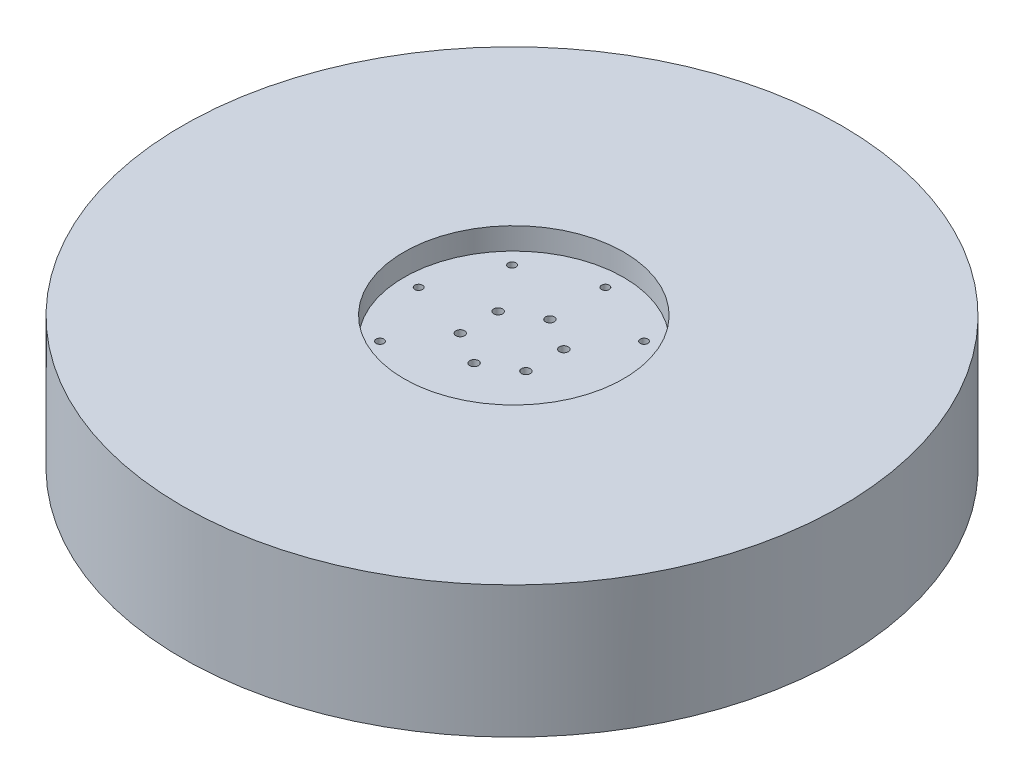
ISO-10303-21;
HEADER;
FILE_DESCRIPTION(('STEP AP214'),'2;1');
FILE_NAME('part.step','',(''),(''),'','','');
FILE_SCHEMA(('AUTOMOTIVE_DESIGN { 1 0 10303 214 1 1 1 1 }'));
ENDSEC;
DATA;
#1=APPLICATION_CONTEXT('core data for automotive mechanical design processes');
#2=APPLICATION_PROTOCOL_DEFINITION('international standard','automotive_design',2000,#1);
#3=PRODUCT_CONTEXT('',#1,'mechanical');
#4=PRODUCT('Part','Part','',(#3));
#5=PRODUCT_RELATED_PRODUCT_CATEGORY('part','',(#4));
#6=PRODUCT_DEFINITION_FORMATION('','',#4);
#7=PRODUCT_DEFINITION_CONTEXT('part definition',#1,'design');
#8=PRODUCT_DEFINITION('design','',#6,#7);
#9=PRODUCT_DEFINITION_SHAPE('','',#8);
#10=(LENGTH_UNIT() NAMED_UNIT(*) SI_UNIT(.MILLI.,.METRE.));
#11=(NAMED_UNIT(*) PLANE_ANGLE_UNIT() SI_UNIT($,.RADIAN.));
#12=(NAMED_UNIT(*) SI_UNIT($,.STERADIAN.) SOLID_ANGLE_UNIT());
#13=UNCERTAINTY_MEASURE_WITH_UNIT(LENGTH_MEASURE(1.E-05),#10,'distance_accuracy_value','');
#14=(GEOMETRIC_REPRESENTATION_CONTEXT(3) GLOBAL_UNCERTAINTY_ASSIGNED_CONTEXT((#13)) GLOBAL_UNIT_ASSIGNED_CONTEXT((#10,
#11,#12)) REPRESENTATION_CONTEXT('',''));
#15=CARTESIAN_POINT('',(0.,0.,0.));
#16=DIRECTION('',(0.,0.,1.));
#17=DIRECTION('',(1.,0.,0.));
#18=AXIS2_PLACEMENT_3D('',#15,#16,#17);
#19=CARTESIAN_POINT('',(0.,0.,0.));
#20=DIRECTION('',(0.,1.,0.));
#21=DIRECTION('',(0.,0.,1.));
#22=AXIS2_PLACEMENT_3D('',#19,#20,#21);
#23=PLANE('',#22);
#24=CARTESIAN_POINT('',(-59.5916333933439,0.,-0.301972321435213));
#25=DIRECTION('',(0.,1.,0.));
#26=DIRECTION('',(0.,0.,1.));
#27=AXIS2_PLACEMENT_3D('',#24,#25,#26);
#28=CIRCLE('',#27,1.75);
#29=CARTESIAN_POINT('',(-59.5916333933439,0.,1.44802767856479));
#30=VERTEX_POINT('',#29);
#31=EDGE_CURVE('E45',#30,#30,#28,.T.);
#32=ORIENTED_EDGE('',*,*,#31,.T.);
#33=EDGE_LOOP('',(#32));
#34=FACE_BOUND('',#33,.T.);
#35=CARTESIAN_POINT('',(-47.1436715937708,0.,29.7500658789924));
#36=DIRECTION('',(0.,1.,0.));
#37=DIRECTION('',(0.,0.,1.));
#38=AXIS2_PLACEMENT_3D('',#35,#36,#37);
#39=CIRCLE('',#38,1.75);
#40=CARTESIAN_POINT('',(-47.1436715937708,0.,31.5000658789924));
#41=VERTEX_POINT('',#40);
#42=EDGE_CURVE('E50',#41,#41,#39,.T.);
#43=ORIENTED_EDGE('',*,*,#42,.T.);
#44=EDGE_LOOP('',(#43));
#45=FACE_BOUND('',#44,.T.);
#46=CARTESIAN_POINT('',(-17.0916333933419,0.,42.1980276785628));
#47=DIRECTION('',(0.,1.,0.));
#48=DIRECTION('',(0.,0.,1.));
#49=AXIS2_PLACEMENT_3D('',#46,#47,#48);
#50=CIRCLE('',#49,1.75000000000001);
#51=CARTESIAN_POINT('',(-17.0916333933419,0.,43.9480276785628));
#52=VERTEX_POINT('',#51);
#53=EDGE_CURVE('E71',#52,#52,#50,.T.);
#54=ORIENTED_EDGE('',*,*,#53,.T.);
#55=EDGE_LOOP('',(#54));
#56=FACE_BOUND('',#55,.T.);
#57=CARTESIAN_POINT('',(12.9604048070858,0.,29.7500658789897));
#58=DIRECTION('',(0.,1.,0.));
#59=DIRECTION('',(0.,0.,1.));
#60=AXIS2_PLACEMENT_3D('',#57,#58,#59);
#61=CIRCLE('',#60,1.75);
#62=CARTESIAN_POINT('',(12.9604048070858,0.,31.5000658789897));
#63=VERTEX_POINT('',#62);
#64=EDGE_CURVE('E68',#63,#63,#61,.T.);
#65=ORIENTED_EDGE('',*,*,#64,.T.);
#66=EDGE_LOOP('',(#65));
#67=FACE_BOUND('',#66,.T.);
#68=CARTESIAN_POINT('',(25.4083666066562,0.,-0.301972321439144));
#69=DIRECTION('',(0.,1.,0.));
#70=DIRECTION('',(0.,0.,1.));
#71=AXIS2_PLACEMENT_3D('',#68,#69,#70);
#72=CIRCLE('',#71,1.75);
#73=CARTESIAN_POINT('',(25.4083666066562,0.,1.44802767856086));
#74=VERTEX_POINT('',#73);
#75=EDGE_CURVE('E65',#74,#74,#72,.T.);
#76=ORIENTED_EDGE('',*,*,#75,.T.);
#77=EDGE_LOOP('',(#76));
#78=FACE_BOUND('',#77,.T.);
#79=CARTESIAN_POINT('',(12.9604048070831,0.,-30.3540105218669));
#80=DIRECTION('',(0.,1.,0.));
#81=DIRECTION('',(0.,0.,1.));
#82=AXIS2_PLACEMENT_3D('',#79,#80,#81);
#83=CIRCLE('',#82,1.75);
#84=CARTESIAN_POINT('',(12.9604048070831,0.,-28.6040105218668));
#85=VERTEX_POINT('',#84);
#86=EDGE_CURVE('E62',#85,#85,#83,.T.);
#87=ORIENTED_EDGE('',*,*,#86,.T.);
#88=EDGE_LOOP('',(#87));
#89=FACE_BOUND('',#88,.T.);
#90=CARTESIAN_POINT('',(-17.0916333933463,0.,-42.8019723214372));
#91=DIRECTION('',(0.,1.,0.));
#92=DIRECTION('',(0.,0.,1.));
#93=AXIS2_PLACEMENT_3D('',#90,#91,#92);
#94=CIRCLE('',#93,1.75);
#95=CARTESIAN_POINT('',(-17.0916333933463,0.,-41.0519723214372));
#96=VERTEX_POINT('',#95);
#97=EDGE_CURVE('E59',#96,#96,#94,.T.);
#98=ORIENTED_EDGE('',*,*,#97,.T.);
#99=EDGE_LOOP('',(#98));
#100=FACE_BOUND('',#99,.T.);
#101=CARTESIAN_POINT('',(-47.1436715937735,0.,-30.3540105218641));
#102=DIRECTION('',(0.,1.,0.));
#103=DIRECTION('',(0.,0.,1.));
#104=AXIS2_PLACEMENT_3D('',#101,#102,#103);
#105=CIRCLE('',#104,1.75);
#106=CARTESIAN_POINT('',(-47.1436715937735,0.,-28.6040105218641));
#107=VERTEX_POINT('',#106);
#108=EDGE_CURVE('E56',#107,#107,#105,.T.);
#109=ORIENTED_EDGE('',*,*,#108,.T.);
#110=EDGE_LOOP('',(#109));
#111=FACE_BOUND('',#110,.T.);
#112=CARTESIAN_POINT('',(-17.0916333933456,0.,-0.301972321437211));
#113=DIRECTION('',(0.,-1.,0.));
#114=DIRECTION('',(0.,0.,-1.));
#115=AXIS2_PLACEMENT_3D('',#112,#113,#114);
#116=CIRCLE('',#115,29.5);
#117=CARTESIAN_POINT('',(-17.0916333933456,0.,-29.8019723214372));
#118=VERTEX_POINT('',#117);
#119=EDGE_CURVE('E85',#118,#118,#116,.T.);
#120=ORIENTED_EDGE('',*,*,#119,.F.);
#121=EDGE_LOOP('',(#120));
#122=FACE_BOUND('',#121,.T.);
#123=CARTESIAN_POINT('',(-17.0916333933463,0.,-0.301972321437215));
#124=DIRECTION('',(0.,-1.,0.));
#125=DIRECTION('',(0.,0.,-1.));
#126=AXIS2_PLACEMENT_3D('',#123,#124,#125);
#127=CIRCLE('',#126,130.);
#128=CARTESIAN_POINT('',(-17.0916333933463,0.,-130.301972321437));
#129=VERTEX_POINT('',#128);
#130=EDGE_CURVE('E255',#129,#129,#127,.T.);
#131=ORIENTED_EDGE('',*,*,#130,.T.);
#132=EDGE_LOOP('',(#131));
#133=FACE_BOUND('',#132,.T.);
#134=ADVANCED_FACE('F37',(#34,#45,#56,#67,#78,#89,#100,#111,#122,#133),#23,.F.);
#135=CARTESIAN_POINT('',(-17.091633393345,25.,16.9480276785628));
#136=DIRECTION('',(0.,-1.,0.));
#137=DIRECTION('',(0.,0.,-1.));
#138=AXIS2_PLACEMENT_3D('',#135,#136,#137);
#139=CYLINDRICAL_SURFACE('',#138,2.);
#140=CARTESIAN_POINT('',(-17.091633393345,6.6,16.9480276785628));
#141=DIRECTION('',(0.,-1.,0.));
#142=DIRECTION('',(0.,0.,-1.));
#143=AXIS2_PLACEMENT_3D('',#140,#141,#142);
#144=CIRCLE('',#143,2.);
#145=CARTESIAN_POINT('',(-17.091633393345,6.6,14.9480276785628));
#146=VERTEX_POINT('',#145);
#147=EDGE_CURVE('E54',#146,#146,#144,.T.);
#148=ORIENTED_EDGE('',*,*,#147,.T.);
#149=EDGE_LOOP('',(#148));
#150=FACE_BOUND('',#149,.T.);
#151=CARTESIAN_POINT('',(-17.091633393345,15.,16.9480276785628));
#152=DIRECTION('',(0.,1.,0.));
#153=DIRECTION('',(0.,0.,1.));
#154=AXIS2_PLACEMENT_3D('',#151,#152,#153);
#155=CIRCLE('',#154,2.);
#156=CARTESIAN_POINT('',(-17.091633393345,15.,18.9480276785628));
#157=VERTEX_POINT('',#156);
#158=EDGE_CURVE('E90',#157,#157,#155,.T.);
#159=ORIENTED_EDGE('',*,*,#158,.T.);
#160=EDGE_LOOP('',(#159));
#161=FACE_BOUND('',#160,.T.);
#162=ADVANCED_FACE('F106',(#150,#161),#139,.F.);
#163=CARTESIAN_POINT('',(-2.15269517806366,25.,8.32302767856223));
#164=DIRECTION('',(0.,-1.,0.));
#165=DIRECTION('',(0.,0.,-1.));
#166=AXIS2_PLACEMENT_3D('',#163,#164,#165);
#167=CYLINDRICAL_SURFACE('',#166,2.);
#168=CARTESIAN_POINT('',(-2.15269517806366,6.6,8.32302767856223));
#169=DIRECTION('',(0.,-1.,0.));
#170=DIRECTION('',(0.,0.,-1.));
#171=AXIS2_PLACEMENT_3D('',#168,#169,#170);
#172=CIRCLE('',#171,2.);
#173=CARTESIAN_POINT('',(-2.15269517806366,6.6,6.32302767856222));
#174=VERTEX_POINT('',#173);
#175=EDGE_CURVE('E99',#174,#174,#172,.T.);
#176=ORIENTED_EDGE('',*,*,#175,.T.);
#177=EDGE_LOOP('',(#176));
#178=FACE_BOUND('',#177,.T.);
#179=CARTESIAN_POINT('',(-2.15269517806366,15.,8.32302767856223));
#180=DIRECTION('',(0.,1.,0.));
#181=DIRECTION('',(0.,0.,1.));
#182=AXIS2_PLACEMENT_3D('',#179,#180,#181);
#183=CIRCLE('',#182,2.);
#184=CARTESIAN_POINT('',(-2.15269517806366,15.,10.3230276785622));
#185=VERTEX_POINT('',#184);
#186=EDGE_CURVE('E143',#185,#185,#183,.T.);
#187=ORIENTED_EDGE('',*,*,#186,.T.);
#188=EDGE_LOOP('',(#187));
#189=FACE_BOUND('',#188,.T.);
#190=ADVANCED_FACE('F231',(#178,#189),#167,.F.);
#191=CARTESIAN_POINT('',(-2.15269517806434,25.,-8.92697232143782));
#192=DIRECTION('',(0.,-1.,0.));
#193=DIRECTION('',(0.,0.,-1.));
#194=AXIS2_PLACEMENT_3D('',#191,#192,#193);
#195=CYLINDRICAL_SURFACE('',#194,2.);
#196=CARTESIAN_POINT('',(-2.15269517806434,6.6,-8.92697232143782));
#197=DIRECTION('',(0.,-1.,0.));
#198=DIRECTION('',(0.,0.,-1.));
#199=AXIS2_PLACEMENT_3D('',#196,#197,#198);
#200=CIRCLE('',#199,2.);
#201=CARTESIAN_POINT('',(-2.15269517806434,6.6,-10.9269723214378));
#202=VERTEX_POINT('',#201);
#203=EDGE_CURVE('E97',#202,#202,#200,.T.);
#204=ORIENTED_EDGE('',*,*,#203,.T.);
#205=EDGE_LOOP('',(#204));
#206=FACE_BOUND('',#205,.T.);
#207=CARTESIAN_POINT('',(-2.15269517806434,15.,-8.92697232143782));
#208=DIRECTION('',(0.,1.,0.));
#209=DIRECTION('',(0.,0.,1.));
#210=AXIS2_PLACEMENT_3D('',#207,#208,#209);
#211=CIRCLE('',#210,2.);
#212=CARTESIAN_POINT('',(-2.15269517806434,15.,-6.92697232143782));
#213=VERTEX_POINT('',#212);
#214=EDGE_CURVE('E135',#213,#213,#211,.T.);
#215=ORIENTED_EDGE('',*,*,#214,.T.);
#216=EDGE_LOOP('',(#215));
#217=FACE_BOUND('',#216,.T.);
#218=ADVANCED_FACE('F338',(#206,#217),#195,.F.);
#219=CARTESIAN_POINT('',(-17.0916333933463,25.,-17.5519723214372));
#220=DIRECTION('',(0.,-1.,0.));
#221=DIRECTION('',(0.,0.,-1.));
#222=AXIS2_PLACEMENT_3D('',#219,#220,#221);
#223=CYLINDRICAL_SURFACE('',#222,2.);
#224=CARTESIAN_POINT('',(-17.0916333933463,6.6,-17.5519723214372));
#225=DIRECTION('',(0.,-1.,0.));
#226=DIRECTION('',(0.,0.,-1.));
#227=AXIS2_PLACEMENT_3D('',#224,#225,#226);
#228=CIRCLE('',#227,2.);
#229=CARTESIAN_POINT('',(-17.0916333933463,6.6,-19.5519723214372));
#230=VERTEX_POINT('',#229);
#231=EDGE_CURVE('E82',#230,#230,#228,.T.);
#232=ORIENTED_EDGE('',*,*,#231,.T.);
#233=EDGE_LOOP('',(#232));
#234=FACE_BOUND('',#233,.T.);
#235=CARTESIAN_POINT('',(-17.0916333933463,15.,-17.5519723214372));
#236=DIRECTION('',(0.,1.,0.));
#237=DIRECTION('',(0.,0.,1.));
#238=AXIS2_PLACEMENT_3D('',#235,#236,#237);
#239=CIRCLE('',#238,2.);
#240=CARTESIAN_POINT('',(-17.0916333933463,15.,-15.5519723214372));
#241=VERTEX_POINT('',#240);
#242=EDGE_CURVE('E131',#241,#241,#239,.T.);
#243=ORIENTED_EDGE('',*,*,#242,.T.);
#244=EDGE_LOOP('',(#243));
#245=FACE_BOUND('',#244,.T.);
#246=ADVANCED_FACE('F126',(#234,#245),#223,.F.);
#247=CARTESIAN_POINT('',(-32.0305716086274,25.,-8.92697232143676));
#248=DIRECTION('',(0.,-1.,0.));
#249=DIRECTION('',(0.,0.,-1.));
#250=AXIS2_PLACEMENT_3D('',#247,#248,#249);
#251=CYLINDRICAL_SURFACE('',#250,2.);
#252=CARTESIAN_POINT('',(-32.0305716086274,6.6,-8.92697232143676));
#253=DIRECTION('',(0.,-1.,0.));
#254=DIRECTION('',(0.,0.,-1.));
#255=AXIS2_PLACEMENT_3D('',#252,#253,#254);
#256=CIRCLE('',#255,2.);
#257=CARTESIAN_POINT('',(-32.0305716086274,6.6,-10.9269723214368));
#258=VERTEX_POINT('',#257);
#259=EDGE_CURVE('E77',#258,#258,#256,.T.);
#260=ORIENTED_EDGE('',*,*,#259,.T.);
#261=EDGE_LOOP('',(#260));
#262=FACE_BOUND('',#261,.T.);
#263=CARTESIAN_POINT('',(-32.0305716086274,15.,-8.92697232143676));
#264=DIRECTION('',(0.,1.,0.));
#265=DIRECTION('',(0.,0.,1.));
#266=AXIS2_PLACEMENT_3D('',#263,#264,#265);
#267=CIRCLE('',#266,2.);
#268=CARTESIAN_POINT('',(-32.0305716086274,15.,-6.92697232143675));
#269=VERTEX_POINT('',#268);
#270=EDGE_CURVE('E129',#269,#269,#267,.T.);
#271=ORIENTED_EDGE('',*,*,#270,.T.);
#272=EDGE_LOOP('',(#271));
#273=FACE_BOUND('',#272,.T.);
#274=ADVANCED_FACE('F39',(#262,#273),#251,.F.);
#275=CARTESIAN_POINT('',(-32.0305716086269,25.,8.32302767856328));
#276=DIRECTION('',(0.,-1.,0.));
#277=DIRECTION('',(0.,0.,-1.));
#278=AXIS2_PLACEMENT_3D('',#275,#276,#277);
#279=CYLINDRICAL_SURFACE('',#278,2.);
#280=CARTESIAN_POINT('',(-32.0305716086269,6.6,8.32302767856328));
#281=DIRECTION('',(0.,-1.,0.));
#282=DIRECTION('',(0.,0.,-1.));
#283=AXIS2_PLACEMENT_3D('',#280,#281,#282);
#284=CIRCLE('',#283,2.);
#285=CARTESIAN_POINT('',(-32.0305716086269,6.6,6.32302767856328));
#286=VERTEX_POINT('',#285);
#287=EDGE_CURVE('E75',#286,#286,#284,.T.);
#288=ORIENTED_EDGE('',*,*,#287,.T.);
#289=EDGE_LOOP('',(#288));
#290=FACE_BOUND('',#289,.T.);
#291=CARTESIAN_POINT('',(-32.0305716086269,15.,8.32302767856328));
#292=DIRECTION('',(0.,1.,0.));
#293=DIRECTION('',(0.,0.,1.));
#294=AXIS2_PLACEMENT_3D('',#291,#292,#293);
#295=CIRCLE('',#294,2.);
#296=CARTESIAN_POINT('',(-32.0305716086269,15.,10.3230276785633));
#297=VERTEX_POINT('',#296);
#298=EDGE_CURVE('E132',#297,#297,#295,.T.);
#299=ORIENTED_EDGE('',*,*,#298,.T.);
#300=EDGE_LOOP('',(#299));
#301=FACE_BOUND('',#300,.T.);
#302=ADVANCED_FACE('F125',(#290,#301),#279,.F.);
#303=CARTESIAN_POINT('',(-59.5916333933439,25.,-0.301972321435213));
#304=DIRECTION('',(0.,-1.,0.));
#305=DIRECTION('',(0.,0.,-1.));
#306=AXIS2_PLACEMENT_3D('',#303,#304,#305);
#307=CYLINDRICAL_SURFACE('',#306,1.75);
#308=ORIENTED_EDGE('',*,*,#31,.F.);
#309=EDGE_LOOP('',(#308));
#310=FACE_BOUND('',#309,.T.);
#311=CARTESIAN_POINT('',(-59.5916333933439,15.,-0.301972321435213));
#312=DIRECTION('',(0.,1.,0.));
#313=DIRECTION('',(0.,0.,1.));
#314=AXIS2_PLACEMENT_3D('',#311,#312,#313);
#315=CIRCLE('',#314,1.75);
#316=CARTESIAN_POINT('',(-59.5916333933439,15.,1.44802767856479));
#317=VERTEX_POINT('',#316);
#318=EDGE_CURVE('E138',#317,#317,#315,.T.);
#319=ORIENTED_EDGE('',*,*,#318,.T.);
#320=EDGE_LOOP('',(#319));
#321=FACE_BOUND('',#320,.T.);
#322=ADVANCED_FACE('F210',(#310,#321),#307,.F.);
#323=CARTESIAN_POINT('',(-47.1436715937708,25.,29.7500658789924));
#324=DIRECTION('',(0.,-1.,0.));
#325=DIRECTION('',(0.,0.,-1.));
#326=AXIS2_PLACEMENT_3D('',#323,#324,#325);
#327=CYLINDRICAL_SURFACE('',#326,1.75);
#328=ORIENTED_EDGE('',*,*,#42,.F.);
#329=EDGE_LOOP('',(#328));
#330=FACE_BOUND('',#329,.T.);
#331=CARTESIAN_POINT('',(-47.1436715937708,15.,29.7500658789924));
#332=DIRECTION('',(0.,1.,0.));
#333=DIRECTION('',(0.,0.,1.));
#334=AXIS2_PLACEMENT_3D('',#331,#332,#333);
#335=CIRCLE('',#334,1.75);
#336=CARTESIAN_POINT('',(-47.1436715937708,15.,31.5000658789924));
#337=VERTEX_POINT('',#336);
#338=EDGE_CURVE('E168',#337,#337,#335,.T.);
#339=ORIENTED_EDGE('',*,*,#338,.T.);
#340=EDGE_LOOP('',(#339));
#341=FACE_BOUND('',#340,.T.);
#342=ADVANCED_FACE('F212',(#330,#341),#327,.F.);
#343=CARTESIAN_POINT('',(-17.0916333933419,25.,42.1980276785628));
#344=DIRECTION('',(0.,-1.,0.));
#345=DIRECTION('',(0.,0.,-1.));
#346=AXIS2_PLACEMENT_3D('',#343,#344,#345);
#347=CYLINDRICAL_SURFACE('',#346,1.75000000000001);
#348=ORIENTED_EDGE('',*,*,#53,.F.);
#349=EDGE_LOOP('',(#348));
#350=FACE_BOUND('',#349,.T.);
#351=CARTESIAN_POINT('',(-17.0916333933419,15.,42.1980276785628));
#352=DIRECTION('',(0.,1.,0.));
#353=DIRECTION('',(0.,0.,1.));
#354=AXIS2_PLACEMENT_3D('',#351,#352,#353);
#355=CIRCLE('',#354,1.75000000000001);
#356=CARTESIAN_POINT('',(-17.0916333933419,15.,43.9480276785628));
#357=VERTEX_POINT('',#356);
#358=EDGE_CURVE('E172',#357,#357,#355,.T.);
#359=ORIENTED_EDGE('',*,*,#358,.T.);
#360=EDGE_LOOP('',(#359));
#361=FACE_BOUND('',#360,.T.);
#362=ADVANCED_FACE('F219',(#350,#361),#347,.F.);
#363=CARTESIAN_POINT('',(12.9604048070858,25.,29.7500658789897));
#364=DIRECTION('',(0.,-1.,0.));
#365=DIRECTION('',(0.,0.,-1.));
#366=AXIS2_PLACEMENT_3D('',#363,#364,#365);
#367=CYLINDRICAL_SURFACE('',#366,1.75);
#368=ORIENTED_EDGE('',*,*,#64,.F.);
#369=EDGE_LOOP('',(#368));
#370=FACE_BOUND('',#369,.T.);
#371=CARTESIAN_POINT('',(12.9604048070858,15.,29.7500658789897));
#372=DIRECTION('',(0.,1.,0.));
#373=DIRECTION('',(0.,0.,1.));
#374=AXIS2_PLACEMENT_3D('',#371,#372,#373);
#375=CIRCLE('',#374,1.75);
#376=CARTESIAN_POINT('',(12.9604048070858,15.,31.5000658789897));
#377=VERTEX_POINT('',#376);
#378=EDGE_CURVE('E176',#377,#377,#375,.T.);
#379=ORIENTED_EDGE('',*,*,#378,.T.);
#380=EDGE_LOOP('',(#379));
#381=FACE_BOUND('',#380,.T.);
#382=ADVANCED_FACE('F390',(#370,#381),#367,.F.);
#383=CARTESIAN_POINT('',(25.4083666066562,25.,-0.301972321439144));
#384=DIRECTION('',(0.,-1.,0.));
#385=DIRECTION('',(0.,0.,-1.));
#386=AXIS2_PLACEMENT_3D('',#383,#384,#385);
#387=CYLINDRICAL_SURFACE('',#386,1.75);
#388=ORIENTED_EDGE('',*,*,#75,.F.);
#389=EDGE_LOOP('',(#388));
#390=FACE_BOUND('',#389,.T.);
#391=CARTESIAN_POINT('',(25.4083666066562,15.,-0.301972321439144));
#392=DIRECTION('',(0.,1.,0.));
#393=DIRECTION('',(0.,0.,1.));
#394=AXIS2_PLACEMENT_3D('',#391,#392,#393);
#395=CIRCLE('',#394,1.75);
#396=CARTESIAN_POINT('',(25.4083666066562,15.,1.44802767856086));
#397=VERTEX_POINT('',#396);
#398=EDGE_CURVE('E180',#397,#397,#395,.T.);
#399=ORIENTED_EDGE('',*,*,#398,.T.);
#400=EDGE_LOOP('',(#399));
#401=FACE_BOUND('',#400,.T.);
#402=ADVANCED_FACE('F401',(#390,#401),#387,.F.);
#403=CARTESIAN_POINT('',(12.9604048070831,25.,-30.3540105218669));
#404=DIRECTION('',(0.,-1.,0.));
#405=DIRECTION('',(0.,0.,-1.));
#406=AXIS2_PLACEMENT_3D('',#403,#404,#405);
#407=CYLINDRICAL_SURFACE('',#406,1.75);
#408=ORIENTED_EDGE('',*,*,#86,.F.);
#409=EDGE_LOOP('',(#408));
#410=FACE_BOUND('',#409,.T.);
#411=CARTESIAN_POINT('',(12.9604048070831,15.,-30.3540105218669));
#412=DIRECTION('',(0.,1.,0.));
#413=DIRECTION('',(0.,0.,1.));
#414=AXIS2_PLACEMENT_3D('',#411,#412,#413);
#415=CIRCLE('',#414,1.75);
#416=CARTESIAN_POINT('',(12.9604048070831,15.,-28.6040105218668));
#417=VERTEX_POINT('',#416);
#418=EDGE_CURVE('E184',#417,#417,#415,.T.);
#419=ORIENTED_EDGE('',*,*,#418,.T.);
#420=EDGE_LOOP('',(#419));
#421=FACE_BOUND('',#420,.T.);
#422=ADVANCED_FACE('F412',(#410,#421),#407,.F.);
#423=CARTESIAN_POINT('',(-17.0916333933463,25.,-42.8019723214372));
#424=DIRECTION('',(0.,-1.,0.));
#425=DIRECTION('',(0.,0.,-1.));
#426=AXIS2_PLACEMENT_3D('',#423,#424,#425);
#427=CYLINDRICAL_SURFACE('',#426,1.75);
#428=ORIENTED_EDGE('',*,*,#97,.F.);
#429=EDGE_LOOP('',(#428));
#430=FACE_BOUND('',#429,.T.);
#431=CARTESIAN_POINT('',(-17.0916333933463,15.,-42.8019723214372));
#432=DIRECTION('',(0.,1.,0.));
#433=DIRECTION('',(0.,0.,1.));
#434=AXIS2_PLACEMENT_3D('',#431,#432,#433);
#435=CIRCLE('',#434,1.75);
#436=CARTESIAN_POINT('',(-17.0916333933463,15.,-41.0519723214372));
#437=VERTEX_POINT('',#436);
#438=EDGE_CURVE('E188',#437,#437,#435,.T.);
#439=ORIENTED_EDGE('',*,*,#438,.T.);
#440=EDGE_LOOP('',(#439));
#441=FACE_BOUND('',#440,.T.);
#442=ADVANCED_FACE('F246',(#430,#441),#427,.F.);
#443=CARTESIAN_POINT('',(-47.1436715937735,25.,-30.3540105218641));
#444=DIRECTION('',(0.,-1.,0.));
#445=DIRECTION('',(0.,0.,-1.));
#446=AXIS2_PLACEMENT_3D('',#443,#444,#445);
#447=CYLINDRICAL_SURFACE('',#446,1.75);
#448=ORIENTED_EDGE('',*,*,#108,.F.);
#449=EDGE_LOOP('',(#448));
#450=FACE_BOUND('',#449,.T.);
#451=CARTESIAN_POINT('',(-47.1436715937735,15.,-30.3540105218641));
#452=DIRECTION('',(0.,1.,0.));
#453=DIRECTION('',(0.,0.,1.));
#454=AXIS2_PLACEMENT_3D('',#451,#452,#453);
#455=CIRCLE('',#454,1.75);
#456=CARTESIAN_POINT('',(-47.1436715937735,15.,-28.6040105218641));
#457=VERTEX_POINT('',#456);
#458=EDGE_CURVE('E41',#457,#457,#455,.T.);
#459=ORIENTED_EDGE('',*,*,#458,.T.);
#460=EDGE_LOOP('',(#459));
#461=FACE_BOUND('',#460,.T.);
#462=ADVANCED_FACE('F239',(#450,#461),#447,.F.);
#463=CARTESIAN_POINT('',(-17.0916333933463,25.,-0.301972321437215));
#464=DIRECTION('',(0.,-1.,0.));
#465=DIRECTION('',(0.,0.,-1.));
#466=AXIS2_PLACEMENT_3D('',#463,#464,#465);
#467=CYLINDRICAL_SURFACE('',#466,150.);
#468=CARTESIAN_POINT('',(-17.0916333933463,25.,-0.301972321437215));
#469=DIRECTION('',(0.,1.,0.));
#470=DIRECTION('',(0.,0.,1.));
#471=AXIS2_PLACEMENT_3D('',#468,#469,#470);
#472=CIRCLE('',#471,150.);
#473=CARTESIAN_POINT('',(-17.0916333933463,25.,149.698027678563));
#474=VERTEX_POINT('',#473);
#475=EDGE_CURVE('E10',#474,#474,#472,.T.);
#476=ORIENTED_EDGE('',*,*,#475,.F.);
#477=EDGE_LOOP('',(#476));
#478=FACE_BOUND('',#477,.T.);
#479=CARTESIAN_POINT('',(-17.0916333933463,-35.,-0.301972321437215));
#480=DIRECTION('',(0.,-1.,0.));
#481=DIRECTION('',(0.,0.,-1.));
#482=AXIS2_PLACEMENT_3D('',#479,#480,#481);
#483=CIRCLE('',#482,150.);
#484=CARTESIAN_POINT('',(-17.0916333933463,-35.,-150.301972321437));
#485=VERTEX_POINT('',#484);
#486=EDGE_CURVE('E199',#485,#485,#483,.T.);
#487=ORIENTED_EDGE('',*,*,#486,.F.);
#488=EDGE_LOOP('',(#487));
#489=FACE_BOUND('',#488,.T.);
#490=ADVANCED_FACE('F237',(#478,#489),#467,.T.);
#491=CARTESIAN_POINT('',(0.,25.,0.));
#492=DIRECTION('',(0.,1.,0.));
#493=DIRECTION('',(0.,0.,1.));
#494=AXIS2_PLACEMENT_3D('',#491,#492,#493);
#495=PLANE('',#494);
#496=CARTESIAN_POINT('',(-16.8880336710603,25.,-0.912771488295409));
#497=DIRECTION('',(0.,1.,0.));
#498=DIRECTION('',(0.,0.,1.));
#499=AXIS2_PLACEMENT_3D('',#496,#497,#498);
#500=CIRCLE('',#499,50.);
#501=CARTESIAN_POINT('',(-16.8880336710603,25.,49.0872285117046));
#502=VERTEX_POINT('',#501);
#503=EDGE_CURVE('E196',#502,#502,#500,.T.);
#504=ORIENTED_EDGE('',*,*,#503,.F.);
#505=EDGE_LOOP('',(#504));
#506=FACE_BOUND('',#505,.T.);
#507=ORIENTED_EDGE('',*,*,#475,.T.);
#508=EDGE_LOOP('',(#507));
#509=FACE_BOUND('',#508,.T.);
#510=ADVANCED_FACE('F235',(#506,#509),#495,.T.);
#511=CARTESIAN_POINT('',(-17.0916333933456,6.6,-0.301972321437211));
#512=DIRECTION('',(0.,-1.,0.));
#513=DIRECTION('',(0.,0.,-1.));
#514=AXIS2_PLACEMENT_3D('',#511,#512,#513);
#515=CYLINDRICAL_SURFACE('',#514,29.5);
#516=CARTESIAN_POINT('',(-17.0916333933456,6.6,-0.301972321437211));
#517=DIRECTION('',(0.,-1.,0.));
#518=DIRECTION('',(0.,0.,-1.));
#519=AXIS2_PLACEMENT_3D('',#516,#517,#518);
#520=CIRCLE('',#519,29.5);
#521=CARTESIAN_POINT('',(-17.0916333933456,6.6,-29.8019723214372));
#522=VERTEX_POINT('',#521);
#523=EDGE_CURVE('E78',#522,#522,#520,.T.);
#524=ORIENTED_EDGE('',*,*,#523,.F.);
#525=EDGE_LOOP('',(#524));
#526=FACE_BOUND('',#525,.T.);
#527=ORIENTED_EDGE('',*,*,#119,.T.);
#528=EDGE_LOOP('',(#527));
#529=FACE_BOUND('',#528,.T.);
#530=ADVANCED_FACE('F113',(#526,#529),#515,.F.);
#531=CARTESIAN_POINT('',(-17.0916333933456,6.6,-0.301972321437211));
#532=DIRECTION('',(0.,-1.,0.));
#533=DIRECTION('',(0.,0.,-1.));
#534=AXIS2_PLACEMENT_3D('',#531,#532,#533);
#535=PLANE('',#534);
#536=ORIENTED_EDGE('',*,*,#147,.F.);
#537=EDGE_LOOP('',(#536));
#538=FACE_BOUND('',#537,.T.);
#539=ORIENTED_EDGE('',*,*,#175,.F.);
#540=EDGE_LOOP('',(#539));
#541=FACE_BOUND('',#540,.T.);
#542=ORIENTED_EDGE('',*,*,#203,.F.);
#543=EDGE_LOOP('',(#542));
#544=FACE_BOUND('',#543,.T.);
#545=ORIENTED_EDGE('',*,*,#231,.F.);
#546=EDGE_LOOP('',(#545));
#547=FACE_BOUND('',#546,.T.);
#548=ORIENTED_EDGE('',*,*,#259,.F.);
#549=EDGE_LOOP('',(#548));
#550=FACE_BOUND('',#549,.T.);
#551=ORIENTED_EDGE('',*,*,#287,.F.);
#552=EDGE_LOOP('',(#551));
#553=FACE_BOUND('',#552,.T.);
#554=ORIENTED_EDGE('',*,*,#523,.T.);
#555=EDGE_LOOP('',(#554));
#556=FACE_BOUND('',#555,.T.);
#557=ADVANCED_FACE('F109',(#538,#541,#544,#547,#550,#553,#556),#535,.T.);
#558=CARTESIAN_POINT('',(-16.8880336710603,15.,-0.912771488295409));
#559=DIRECTION('',(0.,1.,0.));
#560=DIRECTION('',(0.,0.,1.));
#561=AXIS2_PLACEMENT_3D('',#558,#559,#560);
#562=CYLINDRICAL_SURFACE('',#561,50.);
#563=CARTESIAN_POINT('',(-16.8880336710603,15.,-0.912771488295409));
#564=DIRECTION('',(0.,1.,0.));
#565=DIRECTION('',(0.,0.,1.));
#566=AXIS2_PLACEMENT_3D('',#563,#564,#565);
#567=CIRCLE('',#566,50.);
#568=CARTESIAN_POINT('',(-16.8880336710603,15.,49.0872285117046));
#569=VERTEX_POINT('',#568);
#570=EDGE_CURVE('E194',#569,#569,#567,.T.);
#571=ORIENTED_EDGE('',*,*,#570,.F.);
#572=EDGE_LOOP('',(#571));
#573=FACE_BOUND('',#572,.T.);
#574=ORIENTED_EDGE('',*,*,#503,.T.);
#575=EDGE_LOOP('',(#574));
#576=FACE_BOUND('',#575,.T.);
#577=ADVANCED_FACE('F112',(#573,#576),#562,.F.);
#578=CARTESIAN_POINT('',(-16.8880336710603,15.,-0.912771488295409));
#579=DIRECTION('',(0.,1.,0.));
#580=DIRECTION('',(0.,0.,1.));
#581=AXIS2_PLACEMENT_3D('',#578,#579,#580);
#582=PLANE('',#581);
#583=ORIENTED_EDGE('',*,*,#158,.F.);
#584=EDGE_LOOP('',(#583));
#585=FACE_BOUND('',#584,.T.);
#586=ORIENTED_EDGE('',*,*,#186,.F.);
#587=EDGE_LOOP('',(#586));
#588=FACE_BOUND('',#587,.T.);
#589=ORIENTED_EDGE('',*,*,#214,.F.);
#590=EDGE_LOOP('',(#589));
#591=FACE_BOUND('',#590,.T.);
#592=ORIENTED_EDGE('',*,*,#242,.F.);
#593=EDGE_LOOP('',(#592));
#594=FACE_BOUND('',#593,.T.);
#595=ORIENTED_EDGE('',*,*,#270,.F.);
#596=EDGE_LOOP('',(#595));
#597=FACE_BOUND('',#596,.T.);
#598=ORIENTED_EDGE('',*,*,#298,.F.);
#599=EDGE_LOOP('',(#598));
#600=FACE_BOUND('',#599,.T.);
#601=ORIENTED_EDGE('',*,*,#318,.F.);
#602=EDGE_LOOP('',(#601));
#603=FACE_BOUND('',#602,.T.);
#604=ORIENTED_EDGE('',*,*,#338,.F.);
#605=EDGE_LOOP('',(#604));
#606=FACE_BOUND('',#605,.T.);
#607=ORIENTED_EDGE('',*,*,#358,.F.);
#608=EDGE_LOOP('',(#607));
#609=FACE_BOUND('',#608,.T.);
#610=ORIENTED_EDGE('',*,*,#378,.F.);
#611=EDGE_LOOP('',(#610));
#612=FACE_BOUND('',#611,.T.);
#613=ORIENTED_EDGE('',*,*,#398,.F.);
#614=EDGE_LOOP('',(#613));
#615=FACE_BOUND('',#614,.T.);
#616=ORIENTED_EDGE('',*,*,#418,.F.);
#617=EDGE_LOOP('',(#616));
#618=FACE_BOUND('',#617,.T.);
#619=ORIENTED_EDGE('',*,*,#438,.F.);
#620=EDGE_LOOP('',(#619));
#621=FACE_BOUND('',#620,.T.);
#622=ORIENTED_EDGE('',*,*,#458,.F.);
#623=EDGE_LOOP('',(#622));
#624=FACE_BOUND('',#623,.T.);
#625=ORIENTED_EDGE('',*,*,#570,.T.);
#626=EDGE_LOOP('',(#625));
#627=FACE_BOUND('',#626,.T.);
#628=ADVANCED_FACE('F150',(#585,#588,#591,#594,#597,#600,#603,#606,#609,#612,#615,#618,#621,
#624,#627),#582,.T.);
#629=CARTESIAN_POINT('',(-17.0916333933463,-35.,-0.301972321437215));
#630=DIRECTION('',(0.,-1.,0.));
#631=DIRECTION('',(0.,0.,-1.));
#632=AXIS2_PLACEMENT_3D('',#629,#630,#631);
#633=PLANE('',#632);
#634=ORIENTED_EDGE('',*,*,#486,.T.);
#635=EDGE_LOOP('',(#634));
#636=FACE_BOUND('',#635,.T.);
#637=CARTESIAN_POINT('',(-17.0916333933463,-35.,-0.301972321437215));
#638=DIRECTION('',(0.,-1.,0.));
#639=DIRECTION('',(0.,0.,-1.));
#640=AXIS2_PLACEMENT_3D('',#637,#638,#639);
#641=CIRCLE('',#640,130.);
#642=CARTESIAN_POINT('',(-17.0916333933463,-35.,-130.301972321437));
#643=VERTEX_POINT('',#642);
#644=EDGE_CURVE('E253',#643,#643,#641,.T.);
#645=ORIENTED_EDGE('',*,*,#644,.F.);
#646=EDGE_LOOP('',(#645));
#647=FACE_BOUND('',#646,.T.);
#648=ADVANCED_FACE('F153',(#636,#647),#633,.T.);
#649=CARTESIAN_POINT('',(-17.0916333933463,-35.,-0.301972321437215));
#650=DIRECTION('',(0.,1.,0.));
#651=DIRECTION('',(0.,0.,1.));
#652=AXIS2_PLACEMENT_3D('',#649,#650,#651);
#653=CYLINDRICAL_SURFACE('',#652,130.);
#654=ORIENTED_EDGE('',*,*,#644,.T.);
#655=EDGE_LOOP('',(#654));
#656=FACE_BOUND('',#655,.T.);
#657=ORIENTED_EDGE('',*,*,#130,.F.);
#658=EDGE_LOOP('',(#657));
#659=FACE_BOUND('',#658,.T.);
#660=ADVANCED_FACE('F263',(#656,#659),#653,.F.);
#661=CLOSED_SHELL('',(#134,#162,#190,#218,#246,#274,#302,#322,#342,#362,#382,#402,#422,#442,
#462,#490,#510,#530,#557,#577,#628,#648,#660));
#662=MANIFOLD_SOLID_BREP('B2',#661);
#663=ADVANCED_BREP_SHAPE_REPRESENTATION('',(#18,#662),#14);
#664=SHAPE_DEFINITION_REPRESENTATION(#9,#663);
ENDSEC;
END-ISO-10303-21;
